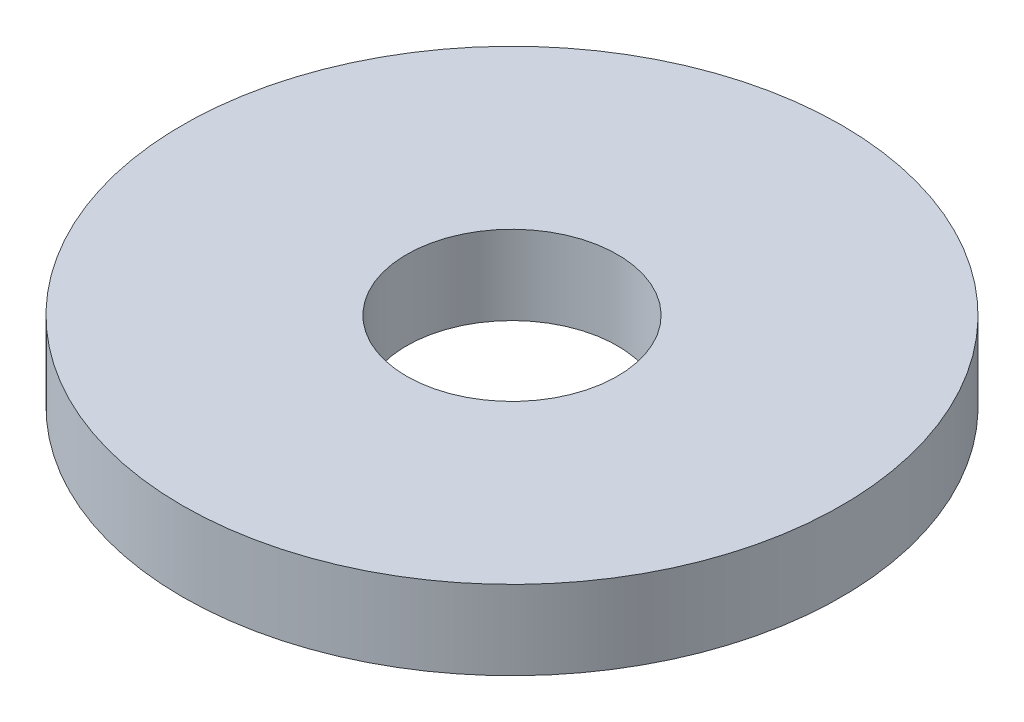
ISO-10303-21;
HEADER;
FILE_DESCRIPTION(('STEP AP214'),'2;1');
FILE_NAME('part.step','',(''),(''),'','','');
FILE_SCHEMA(('AUTOMOTIVE_DESIGN { 1 0 10303 214 1 1 1 1 }'));
ENDSEC;
DATA;
#1=APPLICATION_CONTEXT('core data for automotive mechanical design processes');
#2=APPLICATION_PROTOCOL_DEFINITION('international standard','automotive_design',2000,#1);
#3=PRODUCT_CONTEXT('',#1,'mechanical');
#4=PRODUCT('Part','Part','',(#3));
#5=PRODUCT_RELATED_PRODUCT_CATEGORY('part','',(#4));
#6=PRODUCT_DEFINITION_FORMATION('','',#4);
#7=PRODUCT_DEFINITION_CONTEXT('part definition',#1,'design');
#8=PRODUCT_DEFINITION('design','',#6,#7);
#9=PRODUCT_DEFINITION_SHAPE('','',#8);
#10=(LENGTH_UNIT() NAMED_UNIT(*) SI_UNIT(.MILLI.,.METRE.));
#11=(NAMED_UNIT(*) PLANE_ANGLE_UNIT() SI_UNIT($,.RADIAN.));
#12=(NAMED_UNIT(*) SI_UNIT($,.STERADIAN.) SOLID_ANGLE_UNIT());
#13=UNCERTAINTY_MEASURE_WITH_UNIT(LENGTH_MEASURE(1.E-05),#10,'distance_accuracy_value','');
#14=(GEOMETRIC_REPRESENTATION_CONTEXT(3) GLOBAL_UNCERTAINTY_ASSIGNED_CONTEXT((#13)) GLOBAL_UNIT_ASSIGNED_CONTEXT((#10,
#11,#12)) REPRESENTATION_CONTEXT('',''));
#15=CARTESIAN_POINT('',(0.,0.,0.));
#16=DIRECTION('',(0.,0.,1.));
#17=DIRECTION('',(1.,0.,0.));
#18=AXIS2_PLACEMENT_3D('',#15,#16,#17);
#19=CARTESIAN_POINT('',(0.,3.,0.));
#20=DIRECTION('',(0.,1.,0.));
#21=DIRECTION('',(0.,0.,1.));
#22=AXIS2_PLACEMENT_3D('',#19,#20,#21);
#23=PLANE('',#22);
#24=CARTESIAN_POINT('',(0.,3.,0.));
#25=DIRECTION('',(0.,1.,0.));
#26=DIRECTION('',(0.,0.,1.));
#27=AXIS2_PLACEMENT_3D('',#24,#25,#26);
#28=CIRCLE('',#27,12.5);
#29=CARTESIAN_POINT('',(0.,3.,12.5));
#30=VERTEX_POINT('',#29);
#31=EDGE_CURVE('E10',#30,#30,#28,.T.);
#32=ORIENTED_EDGE('',*,*,#31,.T.);
#33=EDGE_LOOP('',(#32));
#34=FACE_BOUND('',#33,.T.);
#35=CARTESIAN_POINT('',(0.,3.,0.));
#36=DIRECTION('',(0.,1.,0.));
#37=DIRECTION('',(0.,0.,1.));
#38=AXIS2_PLACEMENT_3D('',#35,#36,#37);
#39=CIRCLE('',#38,4.);
#40=CARTESIAN_POINT('',(0.,3.,4.));
#41=VERTEX_POINT('',#40);
#42=EDGE_CURVE('E48',#41,#41,#39,.T.);
#43=ORIENTED_EDGE('',*,*,#42,.F.);
#44=EDGE_LOOP('',(#43));
#45=FACE_BOUND('',#44,.T.);
#46=ADVANCED_FACE('F37',(#34,#45),#23,.T.);
#47=CARTESIAN_POINT('',(0.,0.,0.));
#48=DIRECTION('',(0.,1.,0.));
#49=DIRECTION('',(0.,0.,1.));
#50=AXIS2_PLACEMENT_3D('',#47,#48,#49);
#51=PLANE('',#50);
#52=CARTESIAN_POINT('',(0.,0.,0.));
#53=DIRECTION('',(0.,1.,0.));
#54=DIRECTION('',(0.,0.,1.));
#55=AXIS2_PLACEMENT_3D('',#52,#53,#54);
#56=CIRCLE('',#55,12.5);
#57=CARTESIAN_POINT('',(0.,0.,12.5));
#58=VERTEX_POINT('',#57);
#59=EDGE_CURVE('E41',#58,#58,#56,.T.);
#60=ORIENTED_EDGE('',*,*,#59,.F.);
#61=EDGE_LOOP('',(#60));
#62=FACE_BOUND('',#61,.T.);
#63=CARTESIAN_POINT('',(0.,0.,0.));
#64=DIRECTION('',(0.,1.,0.));
#65=DIRECTION('',(0.,0.,1.));
#66=AXIS2_PLACEMENT_3D('',#63,#64,#65);
#67=CIRCLE('',#66,4.);
#68=CARTESIAN_POINT('',(0.,0.,4.));
#69=VERTEX_POINT('',#68);
#70=EDGE_CURVE('E50',#69,#69,#67,.T.);
#71=ORIENTED_EDGE('',*,*,#70,.T.);
#72=EDGE_LOOP('',(#71));
#73=FACE_BOUND('',#72,.T.);
#74=ADVANCED_FACE('F60',(#62,#73),#51,.F.);
#75=CARTESIAN_POINT('',(0.,3.,0.));
#76=DIRECTION('',(0.,-1.,0.));
#77=DIRECTION('',(0.,0.,-1.));
#78=AXIS2_PLACEMENT_3D('',#75,#76,#77);
#79=CYLINDRICAL_SURFACE('',#78,12.5);
#80=ORIENTED_EDGE('',*,*,#31,.F.);
#81=EDGE_LOOP('',(#80));
#82=FACE_BOUND('',#81,.T.);
#83=ORIENTED_EDGE('',*,*,#59,.T.);
#84=EDGE_LOOP('',(#83));
#85=FACE_BOUND('',#84,.T.);
#86=ADVANCED_FACE('F39',(#82,#85),#79,.T.);
#87=CARTESIAN_POINT('',(0.,3.,0.));
#88=DIRECTION('',(0.,-1.,0.));
#89=DIRECTION('',(0.,0.,-1.));
#90=AXIS2_PLACEMENT_3D('',#87,#88,#89);
#91=CYLINDRICAL_SURFACE('',#90,4.);
#92=ORIENTED_EDGE('',*,*,#42,.T.);
#93=EDGE_LOOP('',(#92));
#94=FACE_BOUND('',#93,.T.);
#95=ORIENTED_EDGE('',*,*,#70,.F.);
#96=EDGE_LOOP('',(#95));
#97=FACE_BOUND('',#96,.T.);
#98=ADVANCED_FACE('F56',(#94,#97),#91,.F.);
#99=CLOSED_SHELL('',(#46,#74,#86,#98));
#100=MANIFOLD_SOLID_BREP('B2',#99);
#101=ADVANCED_BREP_SHAPE_REPRESENTATION('',(#18,#100),#14);
#102=SHAPE_DEFINITION_REPRESENTATION(#9,#101);
ENDSEC;
END-ISO-10303-21;
